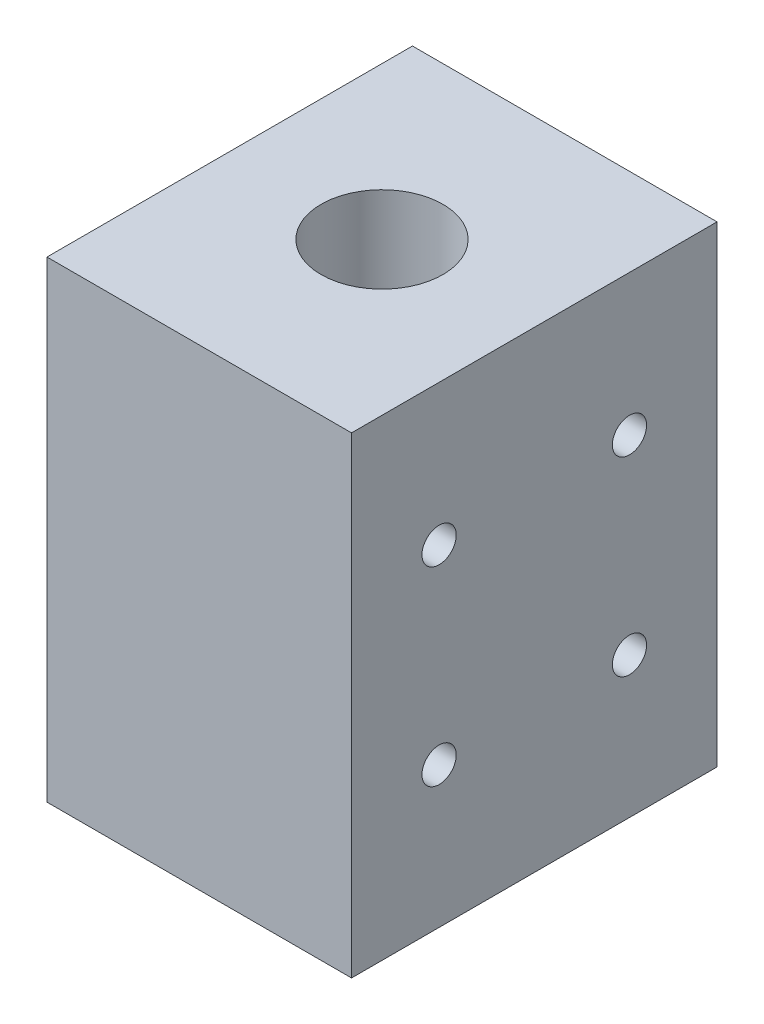
ISO-10303-21;
HEADER;
FILE_DESCRIPTION(('STEP AP214'),'2;1');
FILE_NAME('part.step','',(''),(''),'','','');
FILE_SCHEMA(('AUTOMOTIVE_DESIGN { 1 0 10303 214 1 1 1 1 }'));
ENDSEC;
DATA;
#1=APPLICATION_CONTEXT('core data for automotive mechanical design processes');
#2=APPLICATION_PROTOCOL_DEFINITION('international standard','automotive_design',2000,#1);
#3=PRODUCT_CONTEXT('',#1,'mechanical');
#4=PRODUCT('Part','Part','',(#3));
#5=PRODUCT_RELATED_PRODUCT_CATEGORY('part','',(#4));
#6=PRODUCT_DEFINITION_FORMATION('','',#4);
#7=PRODUCT_DEFINITION_CONTEXT('part definition',#1,'design');
#8=PRODUCT_DEFINITION('design','',#6,#7);
#9=PRODUCT_DEFINITION_SHAPE('','',#8);
#10=(LENGTH_UNIT() NAMED_UNIT(*) SI_UNIT(.MILLI.,.METRE.));
#11=(NAMED_UNIT(*) PLANE_ANGLE_UNIT() SI_UNIT($,.RADIAN.));
#12=(NAMED_UNIT(*) SI_UNIT($,.STERADIAN.) SOLID_ANGLE_UNIT());
#13=UNCERTAINTY_MEASURE_WITH_UNIT(LENGTH_MEASURE(1.E-05),#10,'distance_accuracy_value','');
#14=(GEOMETRIC_REPRESENTATION_CONTEXT(3) GLOBAL_UNCERTAINTY_ASSIGNED_CONTEXT((#13)) GLOBAL_UNIT_ASSIGNED_CONTEXT((#10,
#11,#12)) REPRESENTATION_CONTEXT('',''));
#15=CARTESIAN_POINT('',(0.,0.,0.));
#16=DIRECTION('',(0.,0.,1.));
#17=DIRECTION('',(1.,0.,0.));
#18=AXIS2_PLACEMENT_3D('',#15,#16,#17);
#19=CARTESIAN_POINT('',(0.,62.,0.));
#20=DIRECTION('',(0.,1.,0.));
#21=DIRECTION('',(0.,0.,1.));
#22=AXIS2_PLACEMENT_3D('',#19,#20,#21);
#23=PLANE('',#22);
#24=DIRECTION('',(0.,0.,1.));
#25=VECTOR('',#24,1.);
#26=CARTESIAN_POINT('',(-20.,62.,24.));
#27=LINE('',#26,#25);
#28=CARTESIAN_POINT('',(-20.,62.,-24.));
#29=VERTEX_POINT('',#28);
#30=CARTESIAN_POINT('',(-20.,62.,24.));
#31=VERTEX_POINT('',#30);
#32=EDGE_CURVE('E85',#29,#31,#27,.T.);
#33=ORIENTED_EDGE('',*,*,#32,.T.);
#34=DIRECTION('',(1.,0.,0.));
#35=VECTOR('',#34,1.);
#36=CARTESIAN_POINT('',(20.,62.,24.));
#37=LINE('',#36,#35);
#38=CARTESIAN_POINT('',(20.,62.,24.));
#39=VERTEX_POINT('',#38);
#40=EDGE_CURVE('E80',#31,#39,#37,.T.);
#41=ORIENTED_EDGE('',*,*,#40,.T.);
#42=DIRECTION('',(0.,0.,-1.));
#43=VECTOR('',#42,1.);
#44=CARTESIAN_POINT('',(20.,62.,24.));
#45=LINE('',#44,#43);
#46=CARTESIAN_POINT('',(20.,62.,-24.));
#47=VERTEX_POINT('',#46);
#48=EDGE_CURVE('E83',#39,#47,#45,.T.);
#49=ORIENTED_EDGE('',*,*,#48,.T.);
#50=DIRECTION('',(-1.,0.,0.));
#51=VECTOR('',#50,1.);
#52=CARTESIAN_POINT('',(20.,62.,-24.));
#53=LINE('',#52,#51);
#54=EDGE_CURVE('E50',#47,#29,#53,.T.);
#55=ORIENTED_EDGE('',*,*,#54,.T.);
#56=EDGE_LOOP('',(#33,#41,#49,#55));
#57=FACE_BOUND('',#56,.T.);
#58=CARTESIAN_POINT('',(0.,62.,0.));
#59=DIRECTION('',(0.,1.,0.));
#60=DIRECTION('',(0.,0.,1.));
#61=AXIS2_PLACEMENT_3D('',#58,#59,#60);
#62=CIRCLE('',#61,8.);
#63=CARTESIAN_POINT('',(0.,62.,7.99999999999999));
#64=VERTEX_POINT('',#63);
#65=EDGE_CURVE('E100',#64,#64,#62,.T.);
#66=ORIENTED_EDGE('',*,*,#65,.F.);
#67=EDGE_LOOP('',(#66));
#68=FACE_BOUND('',#67,.T.);
#69=ADVANCED_FACE('F33',(#57,#68),#23,.T.);
#70=CARTESIAN_POINT('',(0.,0.,0.));
#71=DIRECTION('',(0.,1.,0.));
#72=DIRECTION('',(0.,0.,1.));
#73=AXIS2_PLACEMENT_3D('',#70,#71,#72);
#74=PLANE('',#73);
#75=DIRECTION('',(0.,0.,1.));
#76=VECTOR('',#75,1.);
#77=CARTESIAN_POINT('',(-20.,0.,24.));
#78=LINE('',#77,#76);
#79=CARTESIAN_POINT('',(-20.,0.,-24.));
#80=VERTEX_POINT('',#79);
#81=CARTESIAN_POINT('',(-20.,0.,24.));
#82=VERTEX_POINT('',#81);
#83=EDGE_CURVE('E97',#80,#82,#78,.T.);
#84=ORIENTED_EDGE('',*,*,#83,.F.);
#85=DIRECTION('',(-1.,0.,0.));
#86=VECTOR('',#85,1.);
#87=CARTESIAN_POINT('',(20.,0.,-24.));
#88=LINE('',#87,#86);
#89=CARTESIAN_POINT('',(20.,0.,-24.));
#90=VERTEX_POINT('',#89);
#91=EDGE_CURVE('E73',#90,#80,#88,.T.);
#92=ORIENTED_EDGE('',*,*,#91,.F.);
#93=DIRECTION('',(0.,0.,-1.));
#94=VECTOR('',#93,1.);
#95=CARTESIAN_POINT('',(20.,0.,24.));
#96=LINE('',#95,#94);
#97=CARTESIAN_POINT('',(20.,0.,24.));
#98=VERTEX_POINT('',#97);
#99=EDGE_CURVE('E67',#98,#90,#96,.T.);
#100=ORIENTED_EDGE('',*,*,#99,.F.);
#101=DIRECTION('',(1.,0.,0.));
#102=VECTOR('',#101,1.);
#103=CARTESIAN_POINT('',(20.,0.,24.));
#104=LINE('',#103,#102);
#105=EDGE_CURVE('E89',#82,#98,#104,.T.);
#106=ORIENTED_EDGE('',*,*,#105,.F.);
#107=EDGE_LOOP('',(#84,#92,#100,#106));
#108=FACE_BOUND('',#107,.T.);
#109=CARTESIAN_POINT('',(0.,0.,0.));
#110=DIRECTION('',(0.,1.,0.));
#111=DIRECTION('',(0.,0.,1.));
#112=AXIS2_PLACEMENT_3D('',#109,#110,#111);
#113=CIRCLE('',#112,8.);
#114=CARTESIAN_POINT('',(0.,0.,7.99999999999999));
#115=VERTEX_POINT('',#114);
#116=EDGE_CURVE('E112',#115,#115,#113,.T.);
#117=ORIENTED_EDGE('',*,*,#116,.T.);
#118=EDGE_LOOP('',(#117));
#119=FACE_BOUND('',#118,.T.);
#120=ADVANCED_FACE('F108',(#108,#119),#74,.F.);
#121=CARTESIAN_POINT('',(-20.,62.,24.));
#122=DIRECTION('',(1.,0.,0.));
#123=DIRECTION('',(0.,0.,-1.));
#124=AXIS2_PLACEMENT_3D('',#121,#122,#123);
#125=PLANE('',#124);
#126=ORIENTED_EDGE('',*,*,#83,.T.);
#127=DIRECTION('',(0.,-1.,0.));
#128=VECTOR('',#127,1.);
#129=CARTESIAN_POINT('',(-20.,62.,24.));
#130=LINE('',#129,#128);
#131=EDGE_CURVE('E11',#31,#82,#130,.T.);
#132=ORIENTED_EDGE('',*,*,#131,.F.);
#133=ORIENTED_EDGE('',*,*,#32,.F.);
#134=DIRECTION('',(0.,-1.,0.));
#135=VECTOR('',#134,1.);
#136=CARTESIAN_POINT('',(-20.,62.,-24.));
#137=LINE('',#136,#135);
#138=EDGE_CURVE('E93',#29,#80,#137,.T.);
#139=ORIENTED_EDGE('',*,*,#138,.T.);
#140=EDGE_LOOP('',(#126,#132,#133,#139));
#141=FACE_BOUND('',#140,.T.);
#142=ADVANCED_FACE('F35',(#141),#125,.F.);
#143=CARTESIAN_POINT('',(20.,62.,24.));
#144=DIRECTION('',(0.,0.,-1.));
#145=DIRECTION('',(-1.,0.,0.));
#146=AXIS2_PLACEMENT_3D('',#143,#144,#145);
#147=PLANE('',#146);
#148=ORIENTED_EDGE('',*,*,#105,.T.);
#149=DIRECTION('',(0.,-1.,0.));
#150=VECTOR('',#149,1.);
#151=CARTESIAN_POINT('',(20.,62.,24.));
#152=LINE('',#151,#150);
#153=EDGE_CURVE('E42',#39,#98,#152,.T.);
#154=ORIENTED_EDGE('',*,*,#153,.F.);
#155=ORIENTED_EDGE('',*,*,#40,.F.);
#156=ORIENTED_EDGE('',*,*,#131,.T.);
#157=EDGE_LOOP('',(#148,#154,#155,#156));
#158=FACE_BOUND('',#157,.T.);
#159=ADVANCED_FACE('F88',(#158),#147,.F.);
#160=CARTESIAN_POINT('',(20.,62.,24.));
#161=DIRECTION('',(-1.,0.,0.));
#162=DIRECTION('',(0.,0.,1.));
#163=AXIS2_PLACEMENT_3D('',#160,#161,#162);
#164=PLANE('',#163);
#165=CARTESIAN_POINT('',(20.,43.5,-12.5));
#166=DIRECTION('',(1.,0.,0.));
#167=DIRECTION('',(0.,0.,-1.));
#168=AXIS2_PLACEMENT_3D('',#165,#166,#167);
#169=CIRCLE('',#168,2.25);
#170=CARTESIAN_POINT('',(20.,43.5,-14.75));
#171=VERTEX_POINT('',#170);
#172=EDGE_CURVE('E136',#171,#171,#169,.T.);
#173=ORIENTED_EDGE('',*,*,#172,.F.);
#174=EDGE_LOOP('',(#173));
#175=FACE_BOUND('',#174,.T.);
#176=CARTESIAN_POINT('',(20.,18.5,12.5));
#177=DIRECTION('',(1.,0.,0.));
#178=DIRECTION('',(0.,0.,-1.));
#179=AXIS2_PLACEMENT_3D('',#176,#177,#178);
#180=CIRCLE('',#179,2.25);
#181=CARTESIAN_POINT('',(20.,18.5,10.25));
#182=VERTEX_POINT('',#181);
#183=EDGE_CURVE('E130',#182,#182,#180,.T.);
#184=ORIENTED_EDGE('',*,*,#183,.F.);
#185=EDGE_LOOP('',(#184));
#186=FACE_BOUND('',#185,.T.);
#187=CARTESIAN_POINT('',(20.,18.5,-12.5));
#188=DIRECTION('',(1.,0.,0.));
#189=DIRECTION('',(0.,0.,-1.));
#190=AXIS2_PLACEMENT_3D('',#187,#188,#189);
#191=CIRCLE('',#190,2.25);
#192=CARTESIAN_POINT('',(20.,18.5,-14.75));
#193=VERTEX_POINT('',#192);
#194=EDGE_CURVE('E124',#193,#193,#191,.T.);
#195=ORIENTED_EDGE('',*,*,#194,.F.);
#196=EDGE_LOOP('',(#195));
#197=FACE_BOUND('',#196,.T.);
#198=CARTESIAN_POINT('',(20.,43.5,12.5));
#199=DIRECTION('',(1.,0.,0.));
#200=DIRECTION('',(0.,0.,-1.));
#201=AXIS2_PLACEMENT_3D('',#198,#199,#200);
#202=CIRCLE('',#201,2.25);
#203=CARTESIAN_POINT('',(20.,43.5,10.25));
#204=VERTEX_POINT('',#203);
#205=EDGE_CURVE('E118',#204,#204,#202,.T.);
#206=ORIENTED_EDGE('',*,*,#205,.F.);
#207=EDGE_LOOP('',(#206));
#208=FACE_BOUND('',#207,.T.);
#209=ORIENTED_EDGE('',*,*,#99,.T.);
#210=DIRECTION('',(0.,-1.,0.));
#211=VECTOR('',#210,1.);
#212=CARTESIAN_POINT('',(20.,62.,-24.));
#213=LINE('',#212,#211);
#214=EDGE_CURVE('E90',#47,#90,#213,.T.);
#215=ORIENTED_EDGE('',*,*,#214,.F.);
#216=ORIENTED_EDGE('',*,*,#48,.F.);
#217=ORIENTED_EDGE('',*,*,#153,.T.);
#218=EDGE_LOOP('',(#209,#215,#216,#217));
#219=FACE_BOUND('',#218,.T.);
#220=ADVANCED_FACE('F91',(#175,#186,#197,#208,#219),#164,.F.);
#221=CARTESIAN_POINT('',(20.,62.,-24.));
#222=DIRECTION('',(0.,0.,1.));
#223=DIRECTION('',(1.,0.,0.));
#224=AXIS2_PLACEMENT_3D('',#221,#222,#223);
#225=PLANE('',#224);
#226=ORIENTED_EDGE('',*,*,#91,.T.);
#227=ORIENTED_EDGE('',*,*,#138,.F.);
#228=ORIENTED_EDGE('',*,*,#54,.F.);
#229=ORIENTED_EDGE('',*,*,#214,.T.);
#230=EDGE_LOOP('',(#226,#227,#228,#229));
#231=FACE_BOUND('',#230,.T.);
#232=ADVANCED_FACE('F105',(#231),#225,.F.);
#233=CARTESIAN_POINT('',(0.,62.,0.));
#234=DIRECTION('',(0.,-1.,0.));
#235=DIRECTION('',(0.,0.,-1.));
#236=AXIS2_PLACEMENT_3D('',#233,#234,#235);
#237=CYLINDRICAL_SURFACE('',#236,8.);
#238=ORIENTED_EDGE('',*,*,#65,.T.);
#239=EDGE_LOOP('',(#238));
#240=FACE_BOUND('',#239,.T.);
#241=ORIENTED_EDGE('',*,*,#116,.F.);
#242=EDGE_LOOP('',(#241));
#243=FACE_BOUND('',#242,.T.);
#244=ADVANCED_FACE('F163',(#240,#243),#237,.F.);
#245=CARTESIAN_POINT('',(-10.,43.5,12.5));
#246=DIRECTION('',(1.,0.,0.));
#247=DIRECTION('',(0.,0.,-1.));
#248=AXIS2_PLACEMENT_3D('',#245,#246,#247);
#249=CYLINDRICAL_SURFACE('',#248,2.25);
#250=CARTESIAN_POINT('',(-10.,43.5,12.5));
#251=DIRECTION('',(1.,0.,0.));
#252=DIRECTION('',(0.,0.,-1.));
#253=AXIS2_PLACEMENT_3D('',#250,#251,#252);
#254=CIRCLE('',#253,2.25);
#255=CARTESIAN_POINT('',(-10.,43.5,10.25));
#256=VERTEX_POINT('',#255);
#257=EDGE_CURVE('E115',#256,#256,#254,.T.);
#258=ORIENTED_EDGE('',*,*,#257,.F.);
#259=EDGE_LOOP('',(#258));
#260=FACE_BOUND('',#259,.T.);
#261=ORIENTED_EDGE('',*,*,#205,.T.);
#262=EDGE_LOOP('',(#261));
#263=FACE_BOUND('',#262,.T.);
#264=ADVANCED_FACE('F160',(#260,#263),#249,.F.);
#265=CARTESIAN_POINT('',(-10.,43.5,12.5));
#266=DIRECTION('',(1.,0.,0.));
#267=DIRECTION('',(0.,0.,-1.));
#268=AXIS2_PLACEMENT_3D('',#265,#266,#267);
#269=PLANE('',#268);
#270=ORIENTED_EDGE('',*,*,#257,.T.);
#271=EDGE_LOOP('',(#270));
#272=FACE_BOUND('',#271,.T.);
#273=ADVANCED_FACE('F162',(#272),#269,.T.);
#274=CARTESIAN_POINT('',(-10.,18.5,-12.5));
#275=DIRECTION('',(1.,0.,0.));
#276=DIRECTION('',(0.,0.,-1.));
#277=AXIS2_PLACEMENT_3D('',#274,#275,#276);
#278=CYLINDRICAL_SURFACE('',#277,2.25);
#279=CARTESIAN_POINT('',(-10.,18.5,-12.5));
#280=DIRECTION('',(1.,0.,0.));
#281=DIRECTION('',(0.,0.,-1.));
#282=AXIS2_PLACEMENT_3D('',#279,#280,#281);
#283=CIRCLE('',#282,2.25);
#284=CARTESIAN_POINT('',(-10.,18.5,-14.75));
#285=VERTEX_POINT('',#284);
#286=EDGE_CURVE('E127',#285,#285,#283,.T.);
#287=ORIENTED_EDGE('',*,*,#286,.F.);
#288=EDGE_LOOP('',(#287));
#289=FACE_BOUND('',#288,.T.);
#290=ORIENTED_EDGE('',*,*,#194,.T.);
#291=EDGE_LOOP('',(#290));
#292=FACE_BOUND('',#291,.T.);
#293=ADVANCED_FACE('F170',(#289,#292),#278,.F.);
#294=CARTESIAN_POINT('',(-10.,18.5,-12.5));
#295=DIRECTION('',(1.,0.,0.));
#296=DIRECTION('',(0.,0.,-1.));
#297=AXIS2_PLACEMENT_3D('',#294,#295,#296);
#298=PLANE('',#297);
#299=ORIENTED_EDGE('',*,*,#286,.T.);
#300=EDGE_LOOP('',(#299));
#301=FACE_BOUND('',#300,.T.);
#302=ADVANCED_FACE('F238',(#301),#298,.T.);
#303=CARTESIAN_POINT('',(-10.,18.5,12.5));
#304=DIRECTION('',(1.,0.,0.));
#305=DIRECTION('',(0.,0.,-1.));
#306=AXIS2_PLACEMENT_3D('',#303,#304,#305);
#307=CYLINDRICAL_SURFACE('',#306,2.25);
#308=CARTESIAN_POINT('',(-10.,18.5,12.5));
#309=DIRECTION('',(1.,0.,0.));
#310=DIRECTION('',(0.,0.,-1.));
#311=AXIS2_PLACEMENT_3D('',#308,#309,#310);
#312=CIRCLE('',#311,2.25);
#313=CARTESIAN_POINT('',(-10.,18.5,10.25));
#314=VERTEX_POINT('',#313);
#315=EDGE_CURVE('E133',#314,#314,#312,.T.);
#316=ORIENTED_EDGE('',*,*,#315,.F.);
#317=EDGE_LOOP('',(#316));
#318=FACE_BOUND('',#317,.T.);
#319=ORIENTED_EDGE('',*,*,#183,.T.);
#320=EDGE_LOOP('',(#319));
#321=FACE_BOUND('',#320,.T.);
#322=ADVANCED_FACE('F247',(#318,#321),#307,.F.);
#323=CARTESIAN_POINT('',(-10.,18.5,12.5));
#324=DIRECTION('',(1.,0.,0.));
#325=DIRECTION('',(0.,0.,-1.));
#326=AXIS2_PLACEMENT_3D('',#323,#324,#325);
#327=PLANE('',#326);
#328=ORIENTED_EDGE('',*,*,#315,.T.);
#329=EDGE_LOOP('',(#328));
#330=FACE_BOUND('',#329,.T.);
#331=ADVANCED_FACE('F147',(#330),#327,.T.);
#332=CARTESIAN_POINT('',(-10.,43.5,-12.5));
#333=DIRECTION('',(1.,0.,0.));
#334=DIRECTION('',(0.,0.,-1.));
#335=AXIS2_PLACEMENT_3D('',#332,#333,#334);
#336=CYLINDRICAL_SURFACE('',#335,2.25);
#337=CARTESIAN_POINT('',(-10.,43.5,-12.5));
#338=DIRECTION('',(1.,0.,0.));
#339=DIRECTION('',(0.,0.,-1.));
#340=AXIS2_PLACEMENT_3D('',#337,#338,#339);
#341=CIRCLE('',#340,2.25);
#342=CARTESIAN_POINT('',(-10.,43.5,-14.75));
#343=VERTEX_POINT('',#342);
#344=EDGE_CURVE('E121',#343,#343,#341,.T.);
#345=ORIENTED_EDGE('',*,*,#344,.F.);
#346=EDGE_LOOP('',(#345));
#347=FACE_BOUND('',#346,.T.);
#348=ORIENTED_EDGE('',*,*,#172,.T.);
#349=EDGE_LOOP('',(#348));
#350=FACE_BOUND('',#349,.T.);
#351=ADVANCED_FACE('F144',(#347,#350),#336,.F.);
#352=CARTESIAN_POINT('',(-10.,43.5,-12.5));
#353=DIRECTION('',(1.,0.,0.));
#354=DIRECTION('',(0.,0.,-1.));
#355=AXIS2_PLACEMENT_3D('',#352,#353,#354);
#356=PLANE('',#355);
#357=ORIENTED_EDGE('',*,*,#344,.T.);
#358=EDGE_LOOP('',(#357));
#359=FACE_BOUND('',#358,.T.);
#360=ADVANCED_FACE('F142',(#359),#356,.T.);
#361=CLOSED_SHELL('',(#69,#120,#142,#159,#220,#232,#244,#264,#273,#293,#302,#322,#331,#351,#360));
#362=MANIFOLD_SOLID_BREP('B2',#361);
#363=ADVANCED_BREP_SHAPE_REPRESENTATION('',(#18,#362),#14);
#364=SHAPE_DEFINITION_REPRESENTATION(#9,#363);
ENDSEC;
END-ISO-10303-21;
